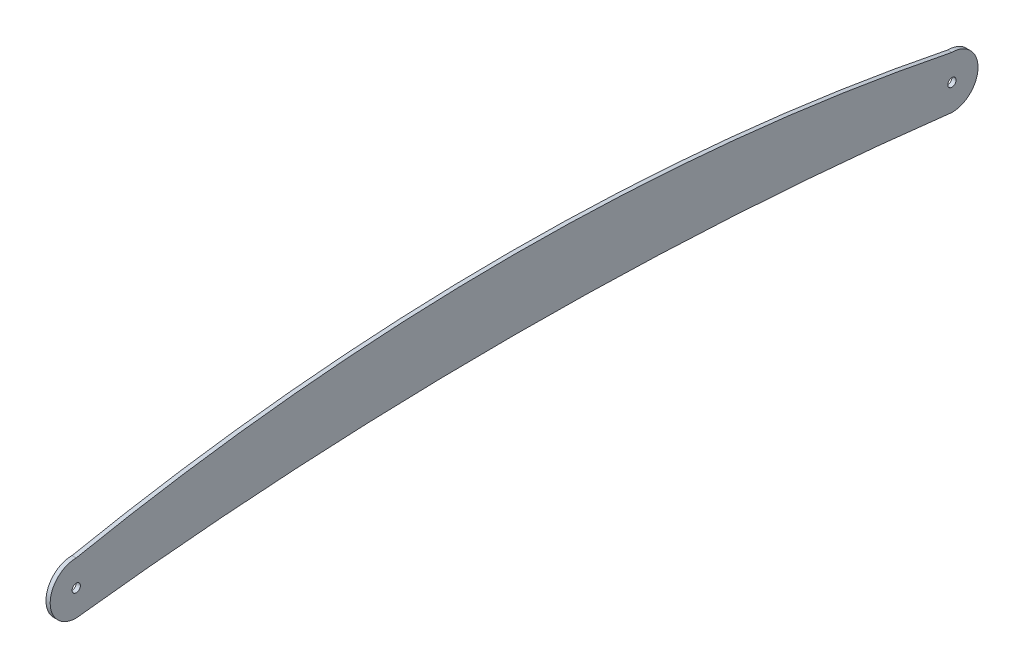
ISO-10303-21;
HEADER;
FILE_DESCRIPTION(('STEP AP214'),'2;1');
FILE_NAME('part.step','',(''),(''),'','','');
FILE_SCHEMA(('AUTOMOTIVE_DESIGN { 1 0 10303 214 1 1 1 1 }'));
ENDSEC;
DATA;
#1=APPLICATION_CONTEXT('core data for automotive mechanical design processes');
#2=APPLICATION_PROTOCOL_DEFINITION('international standard','automotive_design',2000,#1);
#3=PRODUCT_CONTEXT('',#1,'mechanical');
#4=PRODUCT('Part','Part','',(#3));
#5=PRODUCT_RELATED_PRODUCT_CATEGORY('part','',(#4));
#6=PRODUCT_DEFINITION_FORMATION('','',#4);
#7=PRODUCT_DEFINITION_CONTEXT('part definition',#1,'design');
#8=PRODUCT_DEFINITION('design','',#6,#7);
#9=PRODUCT_DEFINITION_SHAPE('','',#8);
#10=(LENGTH_UNIT() NAMED_UNIT(*) SI_UNIT(.MILLI.,.METRE.));
#11=(NAMED_UNIT(*) PLANE_ANGLE_UNIT() SI_UNIT($,.RADIAN.));
#12=(NAMED_UNIT(*) SI_UNIT($,.STERADIAN.) SOLID_ANGLE_UNIT());
#13=UNCERTAINTY_MEASURE_WITH_UNIT(LENGTH_MEASURE(1.E-05),#10,'distance_accuracy_value','');
#14=(GEOMETRIC_REPRESENTATION_CONTEXT(3) GLOBAL_UNCERTAINTY_ASSIGNED_CONTEXT((#13)) GLOBAL_UNIT_ASSIGNED_CONTEXT((#10,
#11,#12)) REPRESENTATION_CONTEXT('',''));
#15=CARTESIAN_POINT('',(0.,0.,0.));
#16=DIRECTION('',(0.,0.,1.));
#17=DIRECTION('',(1.,0.,0.));
#18=AXIS2_PLACEMENT_3D('',#15,#16,#17);
#19=CARTESIAN_POINT('',(2.54,-1302.69687592733,-3.38451776649755));
#20=DIRECTION('',(-1.,0.,0.));
#21=DIRECTION('',(0.,0.,1.));
#22=AXIS2_PLACEMENT_3D('',#19,#20,#21);
#23=CYLINDRICAL_SURFACE('',#22,1345.27345992795);
#24=CARTESIAN_POINT('',(0.,-1302.69687592733,-3.38451776649755));
#25=DIRECTION('',(1.,0.,0.));
#26=DIRECTION('',(0.,0.,-1.));
#27=AXIS2_PLACEMENT_3D('',#24,#25,#26);
#28=CIRCLE('',#27,1345.27345992795);
#29=CARTESIAN_POINT('',(0.,15.8749999999999,263.315482233502));
#30=VERTEX_POINT('',#29);
#31=CARTESIAN_POINT('',(0.,15.875,-270.084517766497));
#32=VERTEX_POINT('',#31);
#33=EDGE_CURVE('E143',#30,#32,#28,.F.);
#34=ORIENTED_EDGE('',*,*,#33,.F.);
#35=DIRECTION('',(-1.,0.,0.));
#36=VECTOR('',#35,1.);
#37=CARTESIAN_POINT('',(2.54,15.8749999999999,263.315482233502));
#38=LINE('',#37,#36);
#39=CARTESIAN_POINT('',(2.54,15.8749999999999,263.315482233502));
#40=VERTEX_POINT('',#39);
#41=EDGE_CURVE('E12',#40,#30,#38,.T.);
#42=ORIENTED_EDGE('',*,*,#41,.F.);
#43=CARTESIAN_POINT('',(2.54,-1302.69687592733,-3.38451776649755));
#44=DIRECTION('',(1.,0.,0.));
#45=DIRECTION('',(0.,0.,-1.));
#46=AXIS2_PLACEMENT_3D('',#43,#44,#45);
#47=CIRCLE('',#46,1345.27345992795);
#48=CARTESIAN_POINT('',(2.54,15.875,-270.084517766497));
#49=VERTEX_POINT('',#48);
#50=EDGE_CURVE('E101',#40,#49,#47,.F.);
#51=ORIENTED_EDGE('',*,*,#50,.T.);
#52=DIRECTION('',(-1.,0.,0.));
#53=VECTOR('',#52,1.);
#54=CARTESIAN_POINT('',(2.54,15.875,-270.084517766497));
#55=LINE('',#54,#53);
#56=EDGE_CURVE('E89',#49,#32,#55,.T.);
#57=ORIENTED_EDGE('',*,*,#56,.T.);
#58=EDGE_LOOP('',(#34,#42,#51,#57));
#59=FACE_BOUND('',#58,.T.);
#60=ADVANCED_FACE('F50',(#59),#23,.T.);
#61=CARTESIAN_POINT('',(2.54,0.,263.315482233503));
#62=DIRECTION('',(-1.,0.,0.));
#63=DIRECTION('',(0.,0.,1.));
#64=AXIS2_PLACEMENT_3D('',#61,#62,#63);
#65=CYLINDRICAL_SURFACE('',#64,15.875);
#66=CARTESIAN_POINT('',(0.,0.,263.315482233503));
#67=DIRECTION('',(1.,0.,0.));
#68=DIRECTION('',(0.,0.,-1.));
#69=AXIS2_PLACEMENT_3D('',#66,#67,#68);
#70=CIRCLE('',#69,15.875);
#71=CARTESIAN_POINT('',(0.,-15.8750000000001,263.315482233504));
#72=VERTEX_POINT('',#71);
#73=EDGE_CURVE('E106',#30,#72,#70,.T.);
#74=ORIENTED_EDGE('',*,*,#73,.T.);
#75=DIRECTION('',(-1.,0.,0.));
#76=VECTOR('',#75,1.);
#77=CARTESIAN_POINT('',(2.54,-15.8750000000001,263.315482233504));
#78=LINE('',#77,#76);
#79=CARTESIAN_POINT('',(2.54,-15.8750000000001,263.315482233504));
#80=VERTEX_POINT('',#79);
#81=EDGE_CURVE('E58',#80,#72,#78,.T.);
#82=ORIENTED_EDGE('',*,*,#81,.F.);
#83=CARTESIAN_POINT('',(2.54,0.,263.315482233503));
#84=DIRECTION('',(1.,0.,0.));
#85=DIRECTION('',(0.,0.,-1.));
#86=AXIS2_PLACEMENT_3D('',#83,#84,#85);
#87=CIRCLE('',#86,15.875);
#88=EDGE_CURVE('E95',#40,#80,#87,.T.);
#89=ORIENTED_EDGE('',*,*,#88,.F.);
#90=ORIENTED_EDGE('',*,*,#41,.T.);
#91=EDGE_LOOP('',(#74,#82,#89,#90));
#92=FACE_BOUND('',#91,.T.);
#93=ADVANCED_FACE('F104',(#92),#65,.T.);
#94=CARTESIAN_POINT('',(2.54,-2247.85671384215,-3.3845177664977));
#95=DIRECTION('',(-1.,0.,0.));
#96=DIRECTION('',(0.,0.,1.));
#97=AXIS2_PLACEMENT_3D('',#94,#95,#96);
#98=CYLINDRICAL_SURFACE('',#97,2247.85926181461);
#99=CARTESIAN_POINT('',(0.,-2247.85671384215,-3.3845177664977));
#100=DIRECTION('',(1.,0.,0.));
#101=DIRECTION('',(0.,0.,-1.));
#102=AXIS2_PLACEMENT_3D('',#99,#100,#101);
#103=CIRCLE('',#102,2247.85926181461);
#104=CARTESIAN_POINT('',(0.,-15.875,-270.084517766499));
#105=VERTEX_POINT('',#104);
#106=EDGE_CURVE('E82',#72,#105,#103,.F.);
#107=ORIENTED_EDGE('',*,*,#106,.T.);
#108=DIRECTION('',(-1.,0.,0.));
#109=VECTOR('',#108,1.);
#110=CARTESIAN_POINT('',(2.54,-15.875,-270.084517766499));
#111=LINE('',#110,#109);
#112=CARTESIAN_POINT('',(2.54,-15.875,-270.084517766499));
#113=VERTEX_POINT('',#112);
#114=EDGE_CURVE('E107',#113,#105,#111,.T.);
#115=ORIENTED_EDGE('',*,*,#114,.F.);
#116=CARTESIAN_POINT('',(2.54,-2247.85671384215,-3.3845177664977));
#117=DIRECTION('',(1.,0.,0.));
#118=DIRECTION('',(0.,0.,-1.));
#119=AXIS2_PLACEMENT_3D('',#116,#117,#118);
#120=CIRCLE('',#119,2247.85926181461);
#121=EDGE_CURVE('E100',#80,#113,#120,.F.);
#122=ORIENTED_EDGE('',*,*,#121,.F.);
#123=ORIENTED_EDGE('',*,*,#81,.T.);
#124=EDGE_LOOP('',(#107,#115,#122,#123));
#125=FACE_BOUND('',#124,.T.);
#126=ADVANCED_FACE('F108',(#125),#98,.F.);
#127=CARTESIAN_POINT('',(2.54,0.,-270.084517766497));
#128=DIRECTION('',(-1.,0.,0.));
#129=DIRECTION('',(0.,0.,1.));
#130=AXIS2_PLACEMENT_3D('',#127,#128,#129);
#131=CYLINDRICAL_SURFACE('',#130,2.54000000000001);
#132=CARTESIAN_POINT('',(2.54,0.,-270.084517766497));
#133=DIRECTION('',(1.,0.,0.));
#134=DIRECTION('',(0.,0.,-1.));
#135=AXIS2_PLACEMENT_3D('',#132,#133,#134);
#136=CIRCLE('',#135,2.54000000000001);
#137=CARTESIAN_POINT('',(2.54,0.,-272.624517766497));
#138=VERTEX_POINT('',#137);
#139=EDGE_CURVE('E111',#138,#138,#136,.T.);
#140=ORIENTED_EDGE('',*,*,#139,.T.);
#141=EDGE_LOOP('',(#140));
#142=FACE_BOUND('',#141,.T.);
#143=CARTESIAN_POINT('',(0.,0.,-270.084517766497));
#144=DIRECTION('',(1.,0.,0.));
#145=DIRECTION('',(0.,0.,-1.));
#146=AXIS2_PLACEMENT_3D('',#143,#144,#145);
#147=CIRCLE('',#146,2.54000000000001);
#148=CARTESIAN_POINT('',(0.,0.,-272.624517766497));
#149=VERTEX_POINT('',#148);
#150=EDGE_CURVE('E121',#149,#149,#147,.T.);
#151=ORIENTED_EDGE('',*,*,#150,.F.);
#152=EDGE_LOOP('',(#151));
#153=FACE_BOUND('',#152,.T.);
#154=ADVANCED_FACE('F152',(#142,#153),#131,.F.);
#155=CARTESIAN_POINT('',(2.54,0.,-270.084517766497));
#156=DIRECTION('',(-1.,0.,0.));
#157=DIRECTION('',(0.,0.,1.));
#158=AXIS2_PLACEMENT_3D('',#155,#156,#157);
#159=CYLINDRICAL_SURFACE('',#158,15.875);
#160=CARTESIAN_POINT('',(0.,0.,-270.084517766497));
#161=DIRECTION('',(1.,0.,0.));
#162=DIRECTION('',(0.,0.,-1.));
#163=AXIS2_PLACEMENT_3D('',#160,#161,#162);
#164=CIRCLE('',#163,15.875);
#165=EDGE_CURVE('E127',#105,#32,#164,.T.);
#166=ORIENTED_EDGE('',*,*,#165,.T.);
#167=ORIENTED_EDGE('',*,*,#56,.F.);
#168=CARTESIAN_POINT('',(2.54,0.,-270.084517766497));
#169=DIRECTION('',(1.,0.,0.));
#170=DIRECTION('',(0.,0.,-1.));
#171=AXIS2_PLACEMENT_3D('',#168,#169,#170);
#172=CIRCLE('',#171,15.875);
#173=EDGE_CURVE('E66',#113,#49,#172,.T.);
#174=ORIENTED_EDGE('',*,*,#173,.F.);
#175=ORIENTED_EDGE('',*,*,#114,.T.);
#176=EDGE_LOOP('',(#166,#167,#174,#175));
#177=FACE_BOUND('',#176,.T.);
#178=ADVANCED_FACE('F138',(#177),#159,.T.);
#179=CARTESIAN_POINT('',(2.54,0.,263.315482233503));
#180=DIRECTION('',(-1.,0.,0.));
#181=DIRECTION('',(0.,0.,1.));
#182=AXIS2_PLACEMENT_3D('',#179,#180,#181);
#183=CYLINDRICAL_SURFACE('',#182,2.54000000000001);
#184=CARTESIAN_POINT('',(2.54,0.,263.315482233503));
#185=DIRECTION('',(1.,0.,0.));
#186=DIRECTION('',(0.,0.,-1.));
#187=AXIS2_PLACEMENT_3D('',#184,#185,#186);
#188=CIRCLE('',#187,2.54000000000001);
#189=CARTESIAN_POINT('',(2.54,0.,260.775482233503));
#190=VERTEX_POINT('',#189);
#191=EDGE_CURVE('E135',#190,#190,#188,.T.);
#192=ORIENTED_EDGE('',*,*,#191,.T.);
#193=EDGE_LOOP('',(#192));
#194=FACE_BOUND('',#193,.T.);
#195=CARTESIAN_POINT('',(0.,0.,263.315482233503));
#196=DIRECTION('',(1.,0.,0.));
#197=DIRECTION('',(0.,0.,-1.));
#198=AXIS2_PLACEMENT_3D('',#195,#196,#197);
#199=CIRCLE('',#198,2.54000000000001);
#200=CARTESIAN_POINT('',(0.,0.,260.775482233503));
#201=VERTEX_POINT('',#200);
#202=EDGE_CURVE('E126',#201,#201,#199,.T.);
#203=ORIENTED_EDGE('',*,*,#202,.F.);
#204=EDGE_LOOP('',(#203));
#205=FACE_BOUND('',#204,.T.);
#206=ADVANCED_FACE('F156',(#194,#205),#183,.F.);
#207=CARTESIAN_POINT('',(2.54,0.,0.));
#208=DIRECTION('',(1.,0.,0.));
#209=DIRECTION('',(0.,0.,-1.));
#210=AXIS2_PLACEMENT_3D('',#207,#208,#209);
#211=PLANE('',#210);
#212=ORIENTED_EDGE('',*,*,#50,.F.);
#213=ORIENTED_EDGE('',*,*,#88,.T.);
#214=ORIENTED_EDGE('',*,*,#121,.T.);
#215=ORIENTED_EDGE('',*,*,#173,.T.);
#216=EDGE_LOOP('',(#212,#213,#214,#215));
#217=FACE_BOUND('',#216,.T.);
#218=ORIENTED_EDGE('',*,*,#139,.F.);
#219=EDGE_LOOP('',(#218));
#220=FACE_BOUND('',#219,.T.);
#221=ORIENTED_EDGE('',*,*,#191,.F.);
#222=EDGE_LOOP('',(#221));
#223=FACE_BOUND('',#222,.T.);
#224=ADVANCED_FACE('F97',(#217,#220,#223),#211,.T.);
#225=CARTESIAN_POINT('',(0.,0.,0.));
#226=DIRECTION('',(1.,0.,0.));
#227=DIRECTION('',(0.,0.,-1.));
#228=AXIS2_PLACEMENT_3D('',#225,#226,#227);
#229=PLANE('',#228);
#230=ORIENTED_EDGE('',*,*,#33,.T.);
#231=ORIENTED_EDGE('',*,*,#165,.F.);
#232=ORIENTED_EDGE('',*,*,#106,.F.);
#233=ORIENTED_EDGE('',*,*,#73,.F.);
#234=EDGE_LOOP('',(#230,#231,#232,#233));
#235=FACE_BOUND('',#234,.T.);
#236=ORIENTED_EDGE('',*,*,#150,.T.);
#237=EDGE_LOOP('',(#236));
#238=FACE_BOUND('',#237,.T.);
#239=ORIENTED_EDGE('',*,*,#202,.T.);
#240=EDGE_LOOP('',(#239));
#241=FACE_BOUND('',#240,.T.);
#242=ADVANCED_FACE('F141',(#235,#238,#241),#229,.F.);
#243=CLOSED_SHELL('',(#60,#93,#126,#154,#178,#206,#224,#242));
#244=MANIFOLD_SOLID_BREP('B2',#243);
#245=ADVANCED_BREP_SHAPE_REPRESENTATION('',(#18,#244),#14);
#246=SHAPE_DEFINITION_REPRESENTATION(#9,#245);
ENDSEC;
END-ISO-10303-21;
